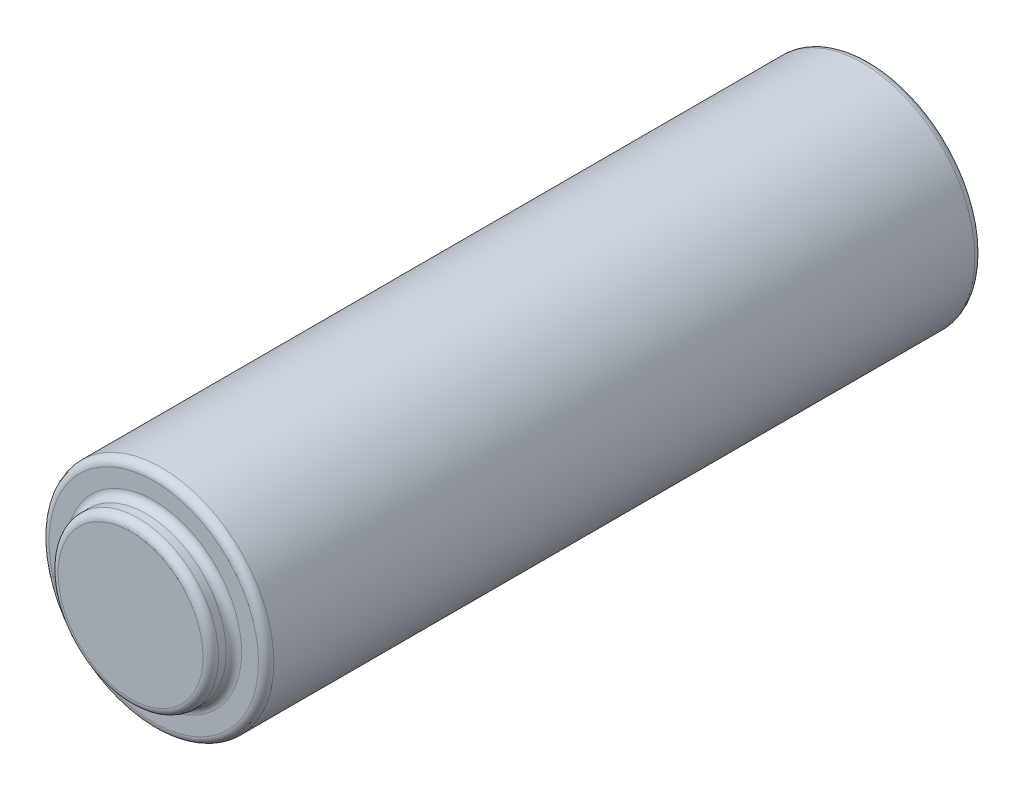
ISO-10303-21;
HEADER;
FILE_DESCRIPTION(('STEP AP214'),'2;1');
FILE_NAME('part.step','',(''),(''),'','','');
FILE_SCHEMA(('AUTOMOTIVE_DESIGN { 1 0 10303 214 1 1 1 1 }'));
ENDSEC;
DATA;
#1=APPLICATION_CONTEXT('core data for automotive mechanical design processes');
#2=APPLICATION_PROTOCOL_DEFINITION('international standard','automotive_design',2000,#1);
#3=PRODUCT_CONTEXT('',#1,'mechanical');
#4=PRODUCT('Part','Part','',(#3));
#5=PRODUCT_RELATED_PRODUCT_CATEGORY('part','',(#4));
#6=PRODUCT_DEFINITION_FORMATION('','',#4);
#7=PRODUCT_DEFINITION_CONTEXT('part definition',#1,'design');
#8=PRODUCT_DEFINITION('design','',#6,#7);
#9=PRODUCT_DEFINITION_SHAPE('','',#8);
#10=(LENGTH_UNIT() NAMED_UNIT(*) SI_UNIT(.MILLI.,.METRE.));
#11=(NAMED_UNIT(*) PLANE_ANGLE_UNIT() SI_UNIT($,.RADIAN.));
#12=(NAMED_UNIT(*) SI_UNIT($,.STERADIAN.) SOLID_ANGLE_UNIT());
#13=UNCERTAINTY_MEASURE_WITH_UNIT(LENGTH_MEASURE(1.E-05),#10,'distance_accuracy_value','');
#14=(GEOMETRIC_REPRESENTATION_CONTEXT(3) GLOBAL_UNCERTAINTY_ASSIGNED_CONTEXT((#13)) GLOBAL_UNIT_ASSIGNED_CONTEXT((#10,
#11,#12)) REPRESENTATION_CONTEXT('',''));
#15=CARTESIAN_POINT('',(0.,0.,0.));
#16=DIRECTION('',(0.,0.,1.));
#17=DIRECTION('',(1.,0.,0.));
#18=AXIS2_PLACEMENT_3D('',#15,#16,#17);
#19=CARTESIAN_POINT('',(23.495,8.89,47.1575010051981));
#20=DIRECTION('',(0.,0.,-1.));
#21=DIRECTION('',(-1.,0.,0.));
#22=AXIS2_PLACEMENT_3D('',#19,#20,#21);
#23=CYLINDRICAL_SURFACE('',#22,7.40044561538614);
#24=CARTESIAN_POINT('',(23.495,8.89,0.508000000000002));
#25=DIRECTION('',(0.,0.,1.));
#26=DIRECTION('',(1.,0.,0.));
#27=AXIS2_PLACEMENT_3D('',#24,#25,#26);
#28=CIRCLE('',#27,7.40044561538614);
#29=CARTESIAN_POINT('',(30.8954456153861,8.89,0.508000000000002));
#30=VERTEX_POINT('',#29);
#31=EDGE_CURVE('E37',#30,#30,#28,.T.);
#32=ORIENTED_EDGE('',*,*,#31,.T.);
#33=EDGE_LOOP('',(#32));
#34=FACE_BOUND('',#33,.T.);
#35=CARTESIAN_POINT('',(23.495,8.89,46.6495010051981));
#36=DIRECTION('',(0.,0.,1.));
#37=DIRECTION('',(1.,0.,0.));
#38=AXIS2_PLACEMENT_3D('',#35,#36,#37);
#39=CIRCLE('',#38,7.40044561538614);
#40=CARTESIAN_POINT('',(30.8954456153861,8.89,46.6495010051981));
#41=VERTEX_POINT('',#40);
#42=EDGE_CURVE('E45',#41,#41,#39,.F.);
#43=ORIENTED_EDGE('',*,*,#42,.T.);
#44=EDGE_LOOP('',(#43));
#45=FACE_BOUND('',#44,.T.);
#46=ADVANCED_FACE('F30',(#34,#45),#23,.T.);
#47=CARTESIAN_POINT('',(23.495,8.89,47.1575010051981));
#48=DIRECTION('',(0.,0.,1.));
#49=DIRECTION('',(1.,0.,0.));
#50=AXIS2_PLACEMENT_3D('',#47,#48,#49);
#51=PLANE('',#50);
#52=CARTESIAN_POINT('',(23.495,8.89,47.1575010051981));
#53=DIRECTION('',(0.,0.,1.));
#54=DIRECTION('',(1.,0.,0.));
#55=AXIS2_PLACEMENT_3D('',#52,#53,#54);
#56=CIRCLE('',#55,6.89244561538614);
#57=CARTESIAN_POINT('',(30.3874456153861,8.89,47.1575010051981));
#58=VERTEX_POINT('',#57);
#59=EDGE_CURVE('E50',#58,#58,#56,.T.);
#60=ORIENTED_EDGE('',*,*,#59,.T.);
#61=EDGE_LOOP('',(#60));
#62=FACE_BOUND('',#61,.T.);
#63=CARTESIAN_POINT('',(23.495,8.89,47.1575010051981));
#64=DIRECTION('',(0.,0.,1.));
#65=DIRECTION('',(1.,0.,0.));
#66=AXIS2_PLACEMENT_3D('',#63,#64,#65);
#67=CIRCLE('',#66,5.78774988366254);
#68=CARTESIAN_POINT('',(29.2827498836625,8.89,47.1575010051981));
#69=VERTEX_POINT('',#68);
#70=EDGE_CURVE('E53',#69,#69,#67,.F.);
#71=ORIENTED_EDGE('',*,*,#70,.T.);
#72=EDGE_LOOP('',(#71));
#73=FACE_BOUND('',#72,.T.);
#74=ADVANCED_FACE('F82',(#62,#73),#51,.T.);
#75=CARTESIAN_POINT('',(23.495,8.89,0.));
#76=DIRECTION('',(0.,0.,1.));
#77=DIRECTION('',(1.,0.,0.));
#78=AXIS2_PLACEMENT_3D('',#75,#76,#77);
#79=PLANE('',#78);
#80=CARTESIAN_POINT('',(23.495,8.89,0.));
#81=DIRECTION('',(0.,0.,1.));
#82=DIRECTION('',(1.,0.,0.));
#83=AXIS2_PLACEMENT_3D('',#80,#81,#82);
#84=CIRCLE('',#83,6.89244561538614);
#85=CARTESIAN_POINT('',(30.3874456153861,8.89,0.));
#86=VERTEX_POINT('',#85);
#87=EDGE_CURVE('E10',#86,#86,#84,.F.);
#88=ORIENTED_EDGE('',*,*,#87,.T.);
#89=EDGE_LOOP('',(#88));
#90=FACE_BOUND('',#89,.T.);
#91=ADVANCED_FACE('F86',(#90),#79,.F.);
#92=CARTESIAN_POINT('',(23.495,8.89,48.6815010051981));
#93=DIRECTION('',(0.,0.,-1.));
#94=DIRECTION('',(-1.,0.,0.));
#95=AXIS2_PLACEMENT_3D('',#92,#93,#94);
#96=CYLINDRICAL_SURFACE('',#95,5.27974988366254);
#97=CARTESIAN_POINT('',(23.495,8.89,47.6655010051981));
#98=DIRECTION('',(0.,0.,1.));
#99=DIRECTION('',(1.,0.,0.));
#100=AXIS2_PLACEMENT_3D('',#97,#98,#99);
#101=CIRCLE('',#100,5.27974988366254);
#102=CARTESIAN_POINT('',(18.2152501163375,8.89,47.6655010051981));
#103=VERTEX_POINT('',#102);
#104=EDGE_CURVE('E41',#103,#103,#101,.T.);
#105=CARTESIAN_POINT('',(23.495,8.89,48.1735010051981));
#106=DIRECTION('',(0.,0.,1.));
#107=DIRECTION('',(1.,0.,0.));
#108=AXIS2_PLACEMENT_3D('',#105,#106,#107);
#109=CIRCLE('',#108,5.27974988366254);
#110=CARTESIAN_POINT('',(18.2152501163375,8.89,48.1735010051981));
#111=VERTEX_POINT('',#110);
#112=EDGE_CURVE('E56',#111,#111,#109,.F.);
#113=CARTESIAN_POINT('',(18.2152501163375,8.89,47.6655010051981));
#114=CARTESIAN_POINT('',(18.2152501163375,8.89,47.6707926718648));
#115=CARTESIAN_POINT('',(18.2152501163375,8.89,47.6760843385314));
#116=CARTESIAN_POINT('',(18.2152501163375,8.89,47.6866676718648));
#117=CARTESIAN_POINT('',(18.2152501163375,8.89,47.6919593385314));
#118=CARTESIAN_POINT('',(18.2152501163375,8.89,47.7025426718648));
#119=CARTESIAN_POINT('',(18.2152501163375,8.89,47.7078343385314));
#120=CARTESIAN_POINT('',(18.2152501163375,8.89,47.7184176718647));
#121=CARTESIAN_POINT('',(18.2152501163375,8.89,47.7237093385314));
#122=CARTESIAN_POINT('',(18.2152501163375,8.89,47.7342926718648));
#123=CARTESIAN_POINT('',(18.2152501163375,8.89,47.7395843385314));
#124=CARTESIAN_POINT('',(18.2152501163375,8.89,47.7501676718648));
#125=CARTESIAN_POINT('',(18.2152501163375,8.89,47.7554593385314));
#126=CARTESIAN_POINT('',(18.2152501163375,8.89,47.7660426718648));
#127=CARTESIAN_POINT('',(18.2152501163375,8.89,47.7713343385314));
#128=CARTESIAN_POINT('',(18.2152501163375,8.89,47.7819176718648));
#129=CARTESIAN_POINT('',(18.2152501163375,8.89,47.7872093385314));
#130=CARTESIAN_POINT('',(18.2152501163375,8.89,47.7977926718647));
#131=CARTESIAN_POINT('',(18.2152501163375,8.89,47.8030843385314));
#132=CARTESIAN_POINT('',(18.2152501163375,8.89,47.8136676718647));
#133=CARTESIAN_POINT('',(18.2152501163375,8.89,47.8189593385314));
#134=CARTESIAN_POINT('',(18.2152501163375,8.89,47.8295426718648));
#135=CARTESIAN_POINT('',(18.2152501163375,8.89,47.8348343385314));
#136=CARTESIAN_POINT('',(18.2152501163375,8.89,47.8454176718648));
#137=CARTESIAN_POINT('',(18.2152501163375,8.89,47.8507093385314));
#138=CARTESIAN_POINT('',(18.2152501163375,8.89,47.8612926718648));
#139=CARTESIAN_POINT('',(18.2152501163375,8.89,47.8665843385314));
#140=CARTESIAN_POINT('',(18.2152501163375,8.89,47.8771676718647));
#141=CARTESIAN_POINT('',(18.2152501163375,8.89,47.8824593385314));
#142=CARTESIAN_POINT('',(18.2152501163375,8.89,47.8930426718647));
#143=CARTESIAN_POINT('',(18.2152501163375,8.89,47.8983343385314));
#144=CARTESIAN_POINT('',(18.2152501163375,8.89,47.9089176718647));
#145=CARTESIAN_POINT('',(18.2152501163375,8.89,47.9142093385314));
#146=CARTESIAN_POINT('',(18.2152501163375,8.89,47.9247926718648));
#147=CARTESIAN_POINT('',(18.2152501163375,8.89,47.9300843385314));
#148=CARTESIAN_POINT('',(18.2152501163375,8.89,47.9406676718648));
#149=CARTESIAN_POINT('',(18.2152501163375,8.89,47.9459593385314));
#150=CARTESIAN_POINT('',(18.2152501163375,8.89,47.9565426718647));
#151=CARTESIAN_POINT('',(18.2152501163375,8.89,47.9618343385314));
#152=CARTESIAN_POINT('',(18.2152501163375,8.89,47.9724176718647));
#153=CARTESIAN_POINT('',(18.2152501163375,8.89,47.9777093385314));
#154=CARTESIAN_POINT('',(18.2152501163375,8.89,47.9882926718647));
#155=CARTESIAN_POINT('',(18.2152501163375,8.89,47.9935843385314));
#156=CARTESIAN_POINT('',(18.2152501163375,8.89,48.0041676718647));
#157=CARTESIAN_POINT('',(18.2152501163375,8.89,48.0094593385314));
#158=CARTESIAN_POINT('',(18.2152501163375,8.89,48.0200426718648));
#159=CARTESIAN_POINT('',(18.2152501163375,8.89,48.0253343385314));
#160=CARTESIAN_POINT('',(18.2152501163375,8.89,48.0359176718648));
#161=CARTESIAN_POINT('',(18.2152501163375,8.89,48.0412093385314));
#162=CARTESIAN_POINT('',(18.2152501163375,8.89,48.0517926718647));
#163=CARTESIAN_POINT('',(18.2152501163375,8.89,48.0570843385314));
#164=CARTESIAN_POINT('',(18.2152501163375,8.89,48.0676676718647));
#165=CARTESIAN_POINT('',(18.2152501163375,8.89,48.0729593385314));
#166=CARTESIAN_POINT('',(18.2152501163375,8.89,48.0835426718647));
#167=CARTESIAN_POINT('',(18.2152501163375,8.89,48.0888343385314));
#168=CARTESIAN_POINT('',(18.2152501163375,8.89,48.0994176718647));
#169=CARTESIAN_POINT('',(18.2152501163375,8.89,48.1047093385314));
#170=CARTESIAN_POINT('',(18.2152501163375,8.89,48.1152926718648));
#171=CARTESIAN_POINT('',(18.2152501163375,8.89,48.1205843385314));
#172=CARTESIAN_POINT('',(18.2152501163375,8.89,48.1311676718647));
#173=CARTESIAN_POINT('',(18.2152501163375,8.89,48.1364593385314));
#174=CARTESIAN_POINT('',(18.2152501163375,8.89,48.1470426718647));
#175=CARTESIAN_POINT('',(18.2152501163375,8.89,48.1523343385314));
#176=CARTESIAN_POINT('',(18.2152501163375,8.89,48.1629176718647));
#177=CARTESIAN_POINT('',(18.2152501163375,8.89,48.1682093385314));
#178=CARTESIAN_POINT('',(18.2152501163375,8.89,48.1735010051981));
#179=B_SPLINE_CURVE_WITH_KNOTS('',3,(#113,#114,#115,#116,#117,#118,#119,#120,#121,#122,#123,
#124,#125,#126,#127,#128,#129,#130,#131,#132,#133,#134,#135,#136,#137,#138,#139,#140,#141,#142,
#143,#144,#145,#146,#147,#148,#149,#150,#151,#152,#153,#154,#155,#156,#157,#158,#159,#160,#161,
#162,#163,#164,#165,#166,#167,#168,#169,#170,#171,#172,#173,#174,#175,#176,#177,#178),
.UNSPECIFIED.,.F.,.F.,(4,2,2,2,2,2,2,2,2,2,2,2,2,2,2,2,2,2,2,2,2,2,2,2,2,2,2,2,2,2,2,2,4),(0.,
0.0158750000000055,0.031750000000004,0.0476250000000025,0.0635000000000011,0.0793749999999996,
0.0952500000000051,0.111125000000004,0.127000000000002,0.142875000000001,0.158749999999999,
0.174625000000005,0.190500000000003,0.206375000000002,0.22225,0.238124999999999,
0.253999999999997,0.269875000000003,0.285750000000001,0.301625,0.317499999999998,
0.333374999999997,0.349250000000002,0.365125000000001,0.380999999999999,0.396874999999998,
0.412749999999996,0.428625000000002,0.4445,0.460374999999999,0.476249999999998,
0.492124999999996,0.507999999999995),.UNSPECIFIED.);
#180=EDGE_CURVE('BSEAM77',#103,#111,#179,.T.);
#181=ORIENTED_EDGE('',*,*,#104,.T.);
#182=ORIENTED_EDGE('',*,*,#112,.T.);
#183=ORIENTED_EDGE('',*,*,#180,.T.);
#184=ORIENTED_EDGE('',*,*,#180,.F.);
#185=EDGE_LOOP('',(#181,#183,#182,#184));
#186=FACE_BOUND('',#185,.T.);
#187=ADVANCED_FACE('F77',(#186),#96,.T.);
#188=CARTESIAN_POINT('',(23.495,8.89,48.6815010051981));
#189=DIRECTION('',(0.,0.,1.));
#190=DIRECTION('',(1.,0.,0.));
#191=AXIS2_PLACEMENT_3D('',#188,#189,#190);
#192=PLANE('',#191);
#193=CARTESIAN_POINT('',(23.495,8.89,48.6815010051981));
#194=DIRECTION('',(0.,0.,1.));
#195=DIRECTION('',(1.,0.,0.));
#196=AXIS2_PLACEMENT_3D('',#193,#194,#195);
#197=CIRCLE('',#196,4.77174988366254);
#198=CARTESIAN_POINT('',(28.2667498836625,8.89,48.6815010051981));
#199=VERTEX_POINT('',#198);
#200=EDGE_CURVE('E59',#199,#199,#197,.T.);
#201=ORIENTED_EDGE('',*,*,#200,.T.);
#202=EDGE_LOOP('',(#201));
#203=FACE_BOUND('',#202,.T.);
#204=ADVANCED_FACE('F63',(#203),#192,.T.);
#205=CARTESIAN_POINT('',(23.495,8.89,48.1735010051981));
#206=DIRECTION('',(0.,0.,1.));
#207=DIRECTION('',(1.,0.,0.));
#208=AXIS2_PLACEMENT_3D('',#205,#206,#207);
#209=TOROIDAL_SURFACE('',#208,4.77174988366254,0.508);
#210=ORIENTED_EDGE('',*,*,#112,.F.);
#211=EDGE_LOOP('',(#210));
#212=FACE_BOUND('',#211,.T.);
#213=ORIENTED_EDGE('',*,*,#200,.F.);
#214=EDGE_LOOP('',(#213));
#215=FACE_BOUND('',#214,.T.);
#216=ADVANCED_FACE('F65',(#212,#215),#209,.T.);
#217=CARTESIAN_POINT('',(23.495,8.89,46.6495010051981));
#218=DIRECTION('',(0.,0.,1.));
#219=DIRECTION('',(1.,0.,0.));
#220=AXIS2_PLACEMENT_3D('',#217,#218,#219);
#221=TOROIDAL_SURFACE('',#220,6.89244561538614,0.508);
#222=ORIENTED_EDGE('',*,*,#42,.F.);
#223=EDGE_LOOP('',(#222));
#224=FACE_BOUND('',#223,.T.);
#225=ORIENTED_EDGE('',*,*,#59,.F.);
#226=EDGE_LOOP('',(#225));
#227=FACE_BOUND('',#226,.T.);
#228=ADVANCED_FACE('F67',(#224,#227),#221,.T.);
#229=CARTESIAN_POINT('',(23.495,8.89,47.6655010051981));
#230=DIRECTION('',(0.,0.,1.));
#231=DIRECTION('',(1.,0.,0.));
#232=AXIS2_PLACEMENT_3D('',#229,#230,#231);
#233=TOROIDAL_SURFACE('',#232,5.78774988366254,0.508);
#234=ORIENTED_EDGE('',*,*,#70,.F.);
#235=EDGE_LOOP('',(#234));
#236=FACE_BOUND('',#235,.T.);
#237=ORIENTED_EDGE('',*,*,#104,.F.);
#238=EDGE_LOOP('',(#237));
#239=FACE_BOUND('',#238,.T.);
#240=ADVANCED_FACE('F74',(#236,#239),#233,.F.);
#241=CARTESIAN_POINT('',(23.495,8.89,0.508000000000002));
#242=DIRECTION('',(0.,0.,1.));
#243=DIRECTION('',(1.,0.,0.));
#244=AXIS2_PLACEMENT_3D('',#241,#242,#243);
#245=TOROIDAL_SURFACE('',#244,6.89244561538614,0.508);
#246=ORIENTED_EDGE('',*,*,#87,.F.);
#247=EDGE_LOOP('',(#246));
#248=FACE_BOUND('',#247,.T.);
#249=ORIENTED_EDGE('',*,*,#31,.F.);
#250=EDGE_LOOP('',(#249));
#251=FACE_BOUND('',#250,.T.);
#252=ADVANCED_FACE('F32',(#248,#251),#245,.T.);
#253=CLOSED_SHELL('',(#46,#74,#91,#187,#204,#216,#228,#240,#252));
#254=MANIFOLD_SOLID_BREP('B2',#253);
#255=ADVANCED_BREP_SHAPE_REPRESENTATION('',(#18,#254),#14);
#256=SHAPE_DEFINITION_REPRESENTATION(#9,#255);
ENDSEC;
END-ISO-10303-21;
